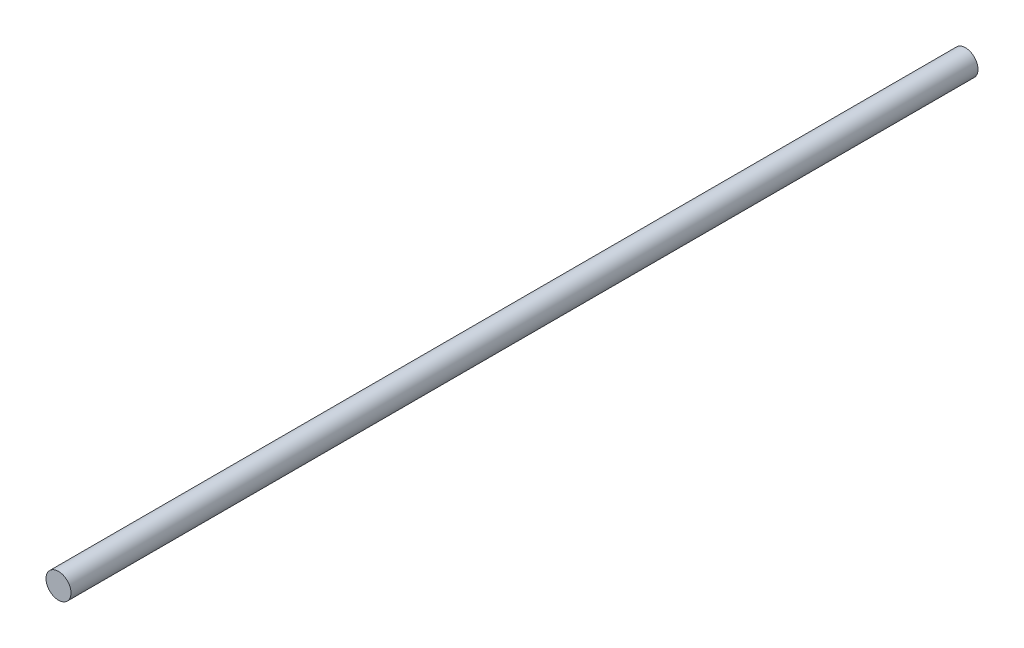
ISO-10303-21;
HEADER;
FILE_DESCRIPTION(('STEP AP214'),'2;1');
FILE_NAME('part.step','',(''),(''),'','','');
FILE_SCHEMA(('AUTOMOTIVE_DESIGN { 1 0 10303 214 1 1 1 1 }'));
ENDSEC;
DATA;
#1=APPLICATION_CONTEXT('core data for automotive mechanical design processes');
#2=APPLICATION_PROTOCOL_DEFINITION('international standard','automotive_design',2000,#1);
#3=PRODUCT_CONTEXT('',#1,'mechanical');
#4=PRODUCT('Part','Part','',(#3));
#5=PRODUCT_RELATED_PRODUCT_CATEGORY('part','',(#4));
#6=PRODUCT_DEFINITION_FORMATION('','',#4);
#7=PRODUCT_DEFINITION_CONTEXT('part definition',#1,'design');
#8=PRODUCT_DEFINITION('design','',#6,#7);
#9=PRODUCT_DEFINITION_SHAPE('','',#8);
#10=(LENGTH_UNIT() NAMED_UNIT(*) SI_UNIT(.MILLI.,.METRE.));
#11=(NAMED_UNIT(*) PLANE_ANGLE_UNIT() SI_UNIT($,.RADIAN.));
#12=(NAMED_UNIT(*) SI_UNIT($,.STERADIAN.) SOLID_ANGLE_UNIT());
#13=UNCERTAINTY_MEASURE_WITH_UNIT(LENGTH_MEASURE(1.E-05),#10,'distance_accuracy_value','');
#14=(GEOMETRIC_REPRESENTATION_CONTEXT(3) GLOBAL_UNCERTAINTY_ASSIGNED_CONTEXT((#13)) GLOBAL_UNIT_ASSIGNED_CONTEXT((#10,
#11,#12)) REPRESENTATION_CONTEXT('',''));
#15=CARTESIAN_POINT('',(0.,0.,0.));
#16=DIRECTION('',(0.,0.,1.));
#17=DIRECTION('',(1.,0.,0.));
#18=AXIS2_PLACEMENT_3D('',#15,#16,#17);
#19=CARTESIAN_POINT('',(0.,0.,145.));
#20=DIRECTION('',(0.,0.,-1.));
#21=DIRECTION('',(-1.,0.,0.));
#22=AXIS2_PLACEMENT_3D('',#19,#20,#21);
#23=CYLINDRICAL_SURFACE('',#22,4.);
#24=CARTESIAN_POINT('',(0.,0.,145.));
#25=DIRECTION('',(0.,0.,1.));
#26=DIRECTION('',(1.,0.,0.));
#27=AXIS2_PLACEMENT_3D('',#24,#25,#26);
#28=CIRCLE('',#27,4.);
#29=CARTESIAN_POINT('',(4.,0.,145.));
#30=VERTEX_POINT('',#29);
#31=EDGE_CURVE('E10',#30,#30,#28,.T.);
#32=ORIENTED_EDGE('',*,*,#31,.F.);
#33=EDGE_LOOP('',(#32));
#34=FACE_BOUND('',#33,.T.);
#35=CARTESIAN_POINT('',(0.,0.,-145.));
#36=DIRECTION('',(0.,0.,1.));
#37=DIRECTION('',(1.,0.,0.));
#38=AXIS2_PLACEMENT_3D('',#35,#36,#37);
#39=CIRCLE('',#38,4.);
#40=CARTESIAN_POINT('',(4.,0.,-145.));
#41=VERTEX_POINT('',#40);
#42=EDGE_CURVE('E37',#41,#41,#39,.T.);
#43=ORIENTED_EDGE('',*,*,#42,.T.);
#44=EDGE_LOOP('',(#43));
#45=FACE_BOUND('',#44,.T.);
#46=ADVANCED_FACE('F34',(#34,#45),#23,.T.);
#47=CARTESIAN_POINT('',(0.,0.,145.));
#48=DIRECTION('',(0.,0.,1.));
#49=DIRECTION('',(1.,0.,0.));
#50=AXIS2_PLACEMENT_3D('',#47,#48,#49);
#51=PLANE('',#50);
#52=ORIENTED_EDGE('',*,*,#31,.T.);
#53=EDGE_LOOP('',(#52));
#54=FACE_BOUND('',#53,.T.);
#55=ADVANCED_FACE('F49',(#54),#51,.T.);
#56=CARTESIAN_POINT('',(0.,0.,-145.));
#57=DIRECTION('',(0.,0.,1.));
#58=DIRECTION('',(1.,0.,0.));
#59=AXIS2_PLACEMENT_3D('',#56,#57,#58);
#60=PLANE('',#59);
#61=ORIENTED_EDGE('',*,*,#42,.F.);
#62=EDGE_LOOP('',(#61));
#63=FACE_BOUND('',#62,.T.);
#64=ADVANCED_FACE('F47',(#63),#60,.F.);
#65=CLOSED_SHELL('',(#46,#55,#64));
#66=MANIFOLD_SOLID_BREP('B2',#65);
#67=ADVANCED_BREP_SHAPE_REPRESENTATION('',(#18,#66),#14);
#68=SHAPE_DEFINITION_REPRESENTATION(#9,#67);
ENDSEC;
END-ISO-10303-21;
